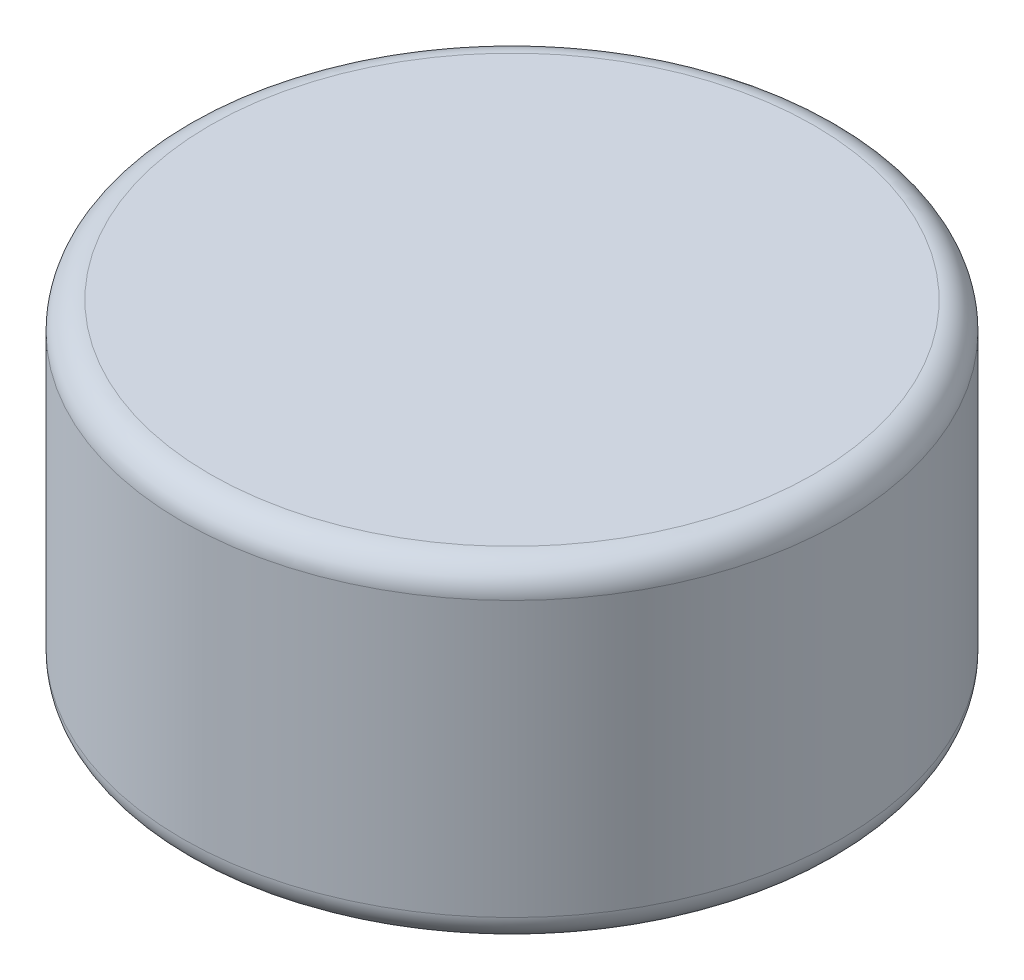
ISO-10303-21;
HEADER;
FILE_DESCRIPTION(('STEP AP214'),'2;1');
FILE_NAME('part.step','',(''),(''),'','','');
FILE_SCHEMA(('AUTOMOTIVE_DESIGN { 1 0 10303 214 1 1 1 1 }'));
ENDSEC;
DATA;
#1=APPLICATION_CONTEXT('core data for automotive mechanical design processes');
#2=APPLICATION_PROTOCOL_DEFINITION('international standard','automotive_design',2000,#1);
#3=PRODUCT_CONTEXT('',#1,'mechanical');
#4=PRODUCT('Part','Part','',(#3));
#5=PRODUCT_RELATED_PRODUCT_CATEGORY('part','',(#4));
#6=PRODUCT_DEFINITION_FORMATION('','',#4);
#7=PRODUCT_DEFINITION_CONTEXT('part definition',#1,'design');
#8=PRODUCT_DEFINITION('design','',#6,#7);
#9=PRODUCT_DEFINITION_SHAPE('','',#8);
#10=(LENGTH_UNIT() NAMED_UNIT(*) SI_UNIT(.MILLI.,.METRE.));
#11=(NAMED_UNIT(*) PLANE_ANGLE_UNIT() SI_UNIT($,.RADIAN.));
#12=(NAMED_UNIT(*) SI_UNIT($,.STERADIAN.) SOLID_ANGLE_UNIT());
#13=UNCERTAINTY_MEASURE_WITH_UNIT(LENGTH_MEASURE(1.E-05),#10,'distance_accuracy_value','');
#14=(GEOMETRIC_REPRESENTATION_CONTEXT(3) GLOBAL_UNCERTAINTY_ASSIGNED_CONTEXT((#13)) GLOBAL_UNIT_ASSIGNED_CONTEXT((#10,
#11,#12)) REPRESENTATION_CONTEXT('',''));
#15=CARTESIAN_POINT('',(0.,0.,0.));
#16=DIRECTION('',(0.,0.,1.));
#17=DIRECTION('',(1.,0.,0.));
#18=AXIS2_PLACEMENT_3D('',#15,#16,#17);
#19=CARTESIAN_POINT('',(126.49035536632,116.696988960403,157.462766086782));
#20=DIRECTION('',(0.,-1.,5.71506033772971E-13));
#21=DIRECTION('',(-1.,0.,0.));
#22=AXIS2_PLACEMENT_3D('',#19,#20,#21);
#23=PLANE('',#22);
#24=CARTESIAN_POINT('',(131.331587666131,116.696988960395,144.524835186833));
#25=DIRECTION('',(0.,1.,-5.71506033772971E-13));
#26=DIRECTION('',(1.,0.,0.));
#27=AXIS2_PLACEMENT_3D('',#24,#25,#26);
#28=CIRCLE('',#27,2.75);
#29=CARTESIAN_POINT('',(131.331587666131,116.696988960397,147.274835186833));
#30=VERTEX_POINT('',#29);
#31=EDGE_CURVE('E25',#30,#30,#28,.T.);
#32=ORIENTED_EDGE('',*,*,#31,.F.);
#33=EDGE_LOOP('',(#32));
#34=FACE_BOUND('',#33,.T.);
#35=ADVANCED_FACE('F17',(#34),#23,.T.);
#36=CARTESIAN_POINT('',(131.331587666131,116.946988960395,144.524835186833));
#37=DIRECTION('',(0.,-1.,5.73171140179814E-13));
#38=DIRECTION('',(0.,-5.73171140179814E-13,-1.));
#39=AXIS2_PLACEMENT_3D('',#36,#37,#38);
#40=TOROIDAL_SURFACE('',#39,2.75,0.25);
#41=ORIENTED_EDGE('',*,*,#31,.T.);
#42=CARTESIAN_POINT('',(131.331587666131,116.946988960397,147.274835186833));
#43=DIRECTION('',(-1.,0.,0.));
#44=DIRECTION('',(0.,5.7435537807275E-13,1.));
#45=AXIS2_PLACEMENT_3D('',#42,#43,#44);
#46=CIRCLE('',#45,0.25);
#47=CARTESIAN_POINT('',(131.331587666131,116.946988960397,147.524835186833));
#48=VERTEX_POINT('',#47);
#49=EDGE_CURVE('E11',#30,#48,#46,.T.);
#50=ORIENTED_EDGE('',*,*,#49,.T.);
#51=CARTESIAN_POINT('',(131.331587666131,116.946988960395,144.524835186833));
#52=DIRECTION('',(0.,-1.,5.71506033772971E-13));
#53=DIRECTION('',(1.,0.,0.));
#54=AXIS2_PLACEMENT_3D('',#51,#52,#53);
#55=CIRCLE('',#54,3.);
#56=CARTESIAN_POINT('',(128.331587666131,116.946988960395,144.524835186833));
#57=VERTEX_POINT('',#56);
#58=EDGE_CURVE('E75',#48,#57,#55,.T.);
#59=ORIENTED_EDGE('',*,*,#58,.T.);
#60=CARTESIAN_POINT('',(131.331587666131,116.946988960395,144.524835186833));
#61=DIRECTION('',(0.,-1.,5.71506033772971E-13));
#62=DIRECTION('',(1.,0.,0.));
#63=AXIS2_PLACEMENT_3D('',#60,#61,#62);
#64=CIRCLE('',#63,3.);
#65=EDGE_CURVE('E64',#57,#48,#64,.T.);
#66=ORIENTED_EDGE('',*,*,#65,.T.);
#67=ORIENTED_EDGE('',*,*,#49,.F.);
#68=EDGE_LOOP('',(#41,#50,#59,#66,#67));
#69=FACE_BOUND('',#68,.T.);
#70=ADVANCED_FACE('F92',(#69),#40,.T.);
#71=CARTESIAN_POINT('',(126.49035536632,119.696988960403,157.462766086781));
#72=DIRECTION('',(0.,-1.,5.71506033772971E-13));
#73=DIRECTION('',(-1.,0.,0.));
#74=AXIS2_PLACEMENT_3D('',#71,#72,#73);
#75=PLANE('',#74);
#76=CARTESIAN_POINT('',(131.331587666131,119.696988960395,144.524835186831));
#77=DIRECTION('',(0.,-1.,5.71506033772971E-13));
#78=DIRECTION('',(1.,0.,0.));
#79=AXIS2_PLACEMENT_3D('',#76,#77,#78);
#80=CIRCLE('',#79,2.75);
#81=CARTESIAN_POINT('',(131.331587666131,119.696988960397,147.274835186831));
#82=VERTEX_POINT('',#81);
#83=EDGE_CURVE('E76',#82,#82,#80,.T.);
#84=ORIENTED_EDGE('',*,*,#83,.F.);
#85=EDGE_LOOP('',(#84));
#86=FACE_BOUND('',#85,.T.);
#87=ADVANCED_FACE('F99',(#86),#75,.F.);
#88=CARTESIAN_POINT('',(131.331587666131,119.696988960395,144.524835186831));
#89=DIRECTION('',(0.,-1.,5.70677376270496E-13));
#90=DIRECTION('',(1.,0.,0.));
#91=AXIS2_PLACEMENT_3D('',#88,#89,#90);
#92=CYLINDRICAL_SURFACE('',#91,3.);
#93=ORIENTED_EDGE('',*,*,#58,.F.);
#94=ORIENTED_EDGE('',*,*,#65,.F.);
#95=DIRECTION('',(0.,1.,-5.70677376270496E-13));
#96=VECTOR('',#95,1.);
#97=CARTESIAN_POINT('',(128.331587666131,119.696988960395,144.524835186831));
#98=LINE('',#97,#96);
#99=CARTESIAN_POINT('',(128.331587666131,119.446988960395,144.524835186831));
#100=VERTEX_POINT('',#99);
#101=EDGE_CURVE('E44',#57,#100,#98,.T.);
#102=ORIENTED_EDGE('',*,*,#101,.T.);
#103=CARTESIAN_POINT('',(131.331587666131,119.446988960395,144.524835186831));
#104=DIRECTION('',(0.,1.,-5.71506033772971E-13));
#105=DIRECTION('',(1.,0.,0.));
#106=AXIS2_PLACEMENT_3D('',#103,#104,#105);
#107=CIRCLE('',#106,3.);
#108=CARTESIAN_POINT('',(131.331587666131,119.446988960397,147.524835186831));
#109=VERTEX_POINT('',#108);
#110=EDGE_CURVE('E62',#109,#100,#107,.T.);
#111=ORIENTED_EDGE('',*,*,#110,.F.);
#112=CARTESIAN_POINT('',(131.331587666131,119.446988960395,144.524835186831));
#113=DIRECTION('',(0.,1.,-5.71506033772971E-13));
#114=DIRECTION('',(1.,0.,0.));
#115=AXIS2_PLACEMENT_3D('',#112,#113,#114);
#116=CIRCLE('',#115,3.);
#117=EDGE_CURVE('E72',#100,#109,#116,.T.);
#118=ORIENTED_EDGE('',*,*,#117,.F.);
#119=ORIENTED_EDGE('',*,*,#101,.F.);
#120=EDGE_LOOP('',(#93,#94,#102,#111,#118,#119));
#121=FACE_BOUND('',#120,.T.);
#122=ADVANCED_FACE('F61',(#121),#92,.T.);
#123=CARTESIAN_POINT('',(131.331587666131,119.446988960395,144.524835186831));
#124=DIRECTION('',(0.,-1.,5.73171140179814E-13));
#125=DIRECTION('',(0.,-5.73171140179814E-13,-1.));
#126=AXIS2_PLACEMENT_3D('',#123,#124,#125);
#127=TOROIDAL_SURFACE('',#126,2.75,0.25);
#128=ORIENTED_EDGE('',*,*,#117,.T.);
#129=CARTESIAN_POINT('',(131.331587666131,119.446988960397,147.274835186831));
#130=DIRECTION('',(-1.,0.,0.));
#131=DIRECTION('',(0.,5.7435537807275E-13,1.));
#132=AXIS2_PLACEMENT_3D('',#129,#130,#131);
#133=CIRCLE('',#132,0.25);
#134=EDGE_CURVE('E73',#109,#82,#133,.T.);
#135=ORIENTED_EDGE('',*,*,#134,.T.);
#136=ORIENTED_EDGE('',*,*,#83,.T.);
#137=ORIENTED_EDGE('',*,*,#134,.F.);
#138=ORIENTED_EDGE('',*,*,#110,.T.);
#139=EDGE_LOOP('',(#128,#135,#136,#137,#138));
#140=FACE_BOUND('',#139,.T.);
#141=ADVANCED_FACE('F70',(#140),#127,.T.);
#142=CLOSED_SHELL('',(#35,#70,#87,#122,#141));
#143=MANIFOLD_SOLID_BREP('B1',#142);
#144=ADVANCED_BREP_SHAPE_REPRESENTATION('',(#18,#143),#14);
#145=SHAPE_DEFINITION_REPRESENTATION(#9,#144);
ENDSEC;
END-ISO-10303-21;
